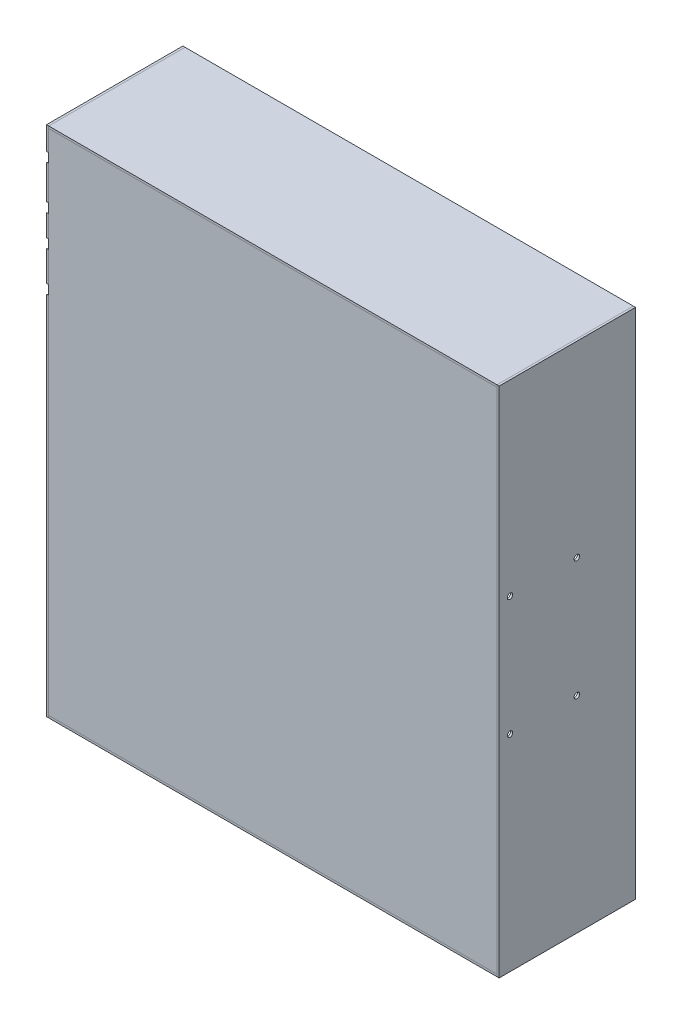
ISO-10303-21;
HEADER;
FILE_DESCRIPTION(('STEP AP214'),'2;1');
FILE_NAME('part.step','',(''),(''),'','','');
FILE_SCHEMA(('AUTOMOTIVE_DESIGN { 1 0 10303 214 1 1 1 1 }'));
ENDSEC;
DATA;
#1=APPLICATION_CONTEXT('core data for automotive mechanical design processes');
#2=APPLICATION_PROTOCOL_DEFINITION('international standard','automotive_design',2000,#1);
#3=PRODUCT_CONTEXT('',#1,'mechanical');
#4=PRODUCT('Part','Part','',(#3));
#5=PRODUCT_RELATED_PRODUCT_CATEGORY('part','',(#4));
#6=PRODUCT_DEFINITION_FORMATION('','',#4);
#7=PRODUCT_DEFINITION_CONTEXT('part definition',#1,'design');
#8=PRODUCT_DEFINITION('design','',#6,#7);
#9=PRODUCT_DEFINITION_SHAPE('','',#8);
#10=(LENGTH_UNIT() NAMED_UNIT(*) SI_UNIT(.MILLI.,.METRE.));
#11=(NAMED_UNIT(*) PLANE_ANGLE_UNIT() SI_UNIT($,.RADIAN.));
#12=(NAMED_UNIT(*) SI_UNIT($,.STERADIAN.) SOLID_ANGLE_UNIT());
#13=UNCERTAINTY_MEASURE_WITH_UNIT(LENGTH_MEASURE(1.E-05),#10,'distance_accuracy_value','');
#14=(GEOMETRIC_REPRESENTATION_CONTEXT(3) GLOBAL_UNCERTAINTY_ASSIGNED_CONTEXT((#13)) GLOBAL_UNIT_ASSIGNED_CONTEXT((#10,
#11,#12)) REPRESENTATION_CONTEXT('',''));
#15=CARTESIAN_POINT('',(0.,0.,0.));
#16=DIRECTION('',(0.,0.,1.));
#17=DIRECTION('',(1.,0.,0.));
#18=AXIS2_PLACEMENT_3D('',#15,#16,#17);
#19=CARTESIAN_POINT('',(-256.013393359467,233.,62.5));
#20=DIRECTION('',(0.,1.,0.));
#21=DIRECTION('',(0.,0.,1.));
#22=AXIS2_PLACEMENT_3D('',#19,#20,#21);
#23=PLANE('',#22);
#24=DIRECTION('',(-1.,0.,0.));
#25=VECTOR('',#24,1.);
#26=CARTESIAN_POINT('',(-207.5,233.,-62.5));
#27=LINE('',#26,#25);
#28=CARTESIAN_POINT('',(205.5,233.,-62.5));
#29=VERTEX_POINT('',#28);
#30=CARTESIAN_POINT('',(-205.5,233.,-62.5));
#31=VERTEX_POINT('',#30);
#32=EDGE_CURVE('E101',#29,#31,#27,.T.);
#33=ORIENTED_EDGE('',*,*,#32,.F.);
#34=DIRECTION('',(0.,0.,-1.));
#35=VECTOR('',#34,1.);
#36=CARTESIAN_POINT('',(205.5,233.,0.));
#37=LINE('',#36,#35);
#38=CARTESIAN_POINT('',(205.5,233.,62.5));
#39=VERTEX_POINT('',#38);
#40=EDGE_CURVE('E12',#39,#29,#37,.T.);
#41=ORIENTED_EDGE('',*,*,#40,.F.);
#42=DIRECTION('',(1.,0.,0.));
#43=VECTOR('',#42,1.);
#44=CARTESIAN_POINT('',(-207.5,233.,62.5));
#45=LINE('',#44,#43);
#46=CARTESIAN_POINT('',(-205.5,233.,62.5));
#47=VERTEX_POINT('',#46);
#48=EDGE_CURVE('E104',#47,#39,#45,.T.);
#49=ORIENTED_EDGE('',*,*,#48,.F.);
#50=DIRECTION('',(0.,0.,1.));
#51=VECTOR('',#50,1.);
#52=CARTESIAN_POINT('',(-205.5,233.,0.));
#53=LINE('',#52,#51);
#54=EDGE_CURVE('E60',#31,#47,#53,.T.);
#55=ORIENTED_EDGE('',*,*,#54,.F.);
#56=EDGE_LOOP('',(#33,#41,#49,#55));
#57=FACE_BOUND('',#56,.T.);
#58=ADVANCED_FACE('F51',(#57),#23,.F.);
#59=CARTESIAN_POINT('',(205.5,235.,-133.832293437024));
#60=DIRECTION('',(-1.,0.,0.));
#61=DIRECTION('',(0.,0.,1.));
#62=AXIS2_PLACEMENT_3D('',#59,#60,#61);
#63=PLANE('',#62);
#64=DIRECTION('',(0.,1.,0.));
#65=VECTOR('',#64,1.);
#66=CARTESIAN_POINT('',(205.5,235.,62.5));
#67=LINE('',#66,#65);
#68=CARTESIAN_POINT('',(205.5,235.,62.5));
#69=VERTEX_POINT('',#68);
#70=EDGE_CURVE('E68',#39,#69,#67,.T.);
#71=ORIENTED_EDGE('',*,*,#70,.F.);
#72=ORIENTED_EDGE('',*,*,#40,.T.);
#73=DIRECTION('',(0.,-1.,0.));
#74=VECTOR('',#73,1.);
#75=CARTESIAN_POINT('',(205.5,235.,-62.5));
#76=LINE('',#75,#74);
#77=CARTESIAN_POINT('',(205.5,235.,-62.5));
#78=VERTEX_POINT('',#77);
#79=EDGE_CURVE('E96',#78,#29,#76,.T.);
#80=ORIENTED_EDGE('',*,*,#79,.F.);
#81=DIRECTION('',(0.,0.,-1.));
#82=VECTOR('',#81,1.);
#83=CARTESIAN_POINT('',(205.5,235.,0.));
#84=LINE('',#83,#82);
#85=EDGE_CURVE('E115',#69,#78,#84,.T.);
#86=ORIENTED_EDGE('',*,*,#85,.F.);
#87=EDGE_LOOP('',(#71,#72,#80,#86));
#88=FACE_BOUND('',#87,.T.);
#89=ADVANCED_FACE('F94',(#88),#63,.F.);
#90=CARTESIAN_POINT('',(-205.5,235.,-133.832293437024));
#91=DIRECTION('',(1.,0.,0.));
#92=DIRECTION('',(0.,0.,-1.));
#93=AXIS2_PLACEMENT_3D('',#90,#91,#92);
#94=PLANE('',#93);
#95=DIRECTION('',(0.,1.,0.));
#96=VECTOR('',#95,1.);
#97=CARTESIAN_POINT('',(-205.5,235.,-62.5));
#98=LINE('',#97,#96);
#99=CARTESIAN_POINT('',(-205.5,235.,-62.5));
#100=VERTEX_POINT('',#99);
#101=EDGE_CURVE('E109',#31,#100,#98,.T.);
#102=ORIENTED_EDGE('',*,*,#101,.F.);
#103=ORIENTED_EDGE('',*,*,#54,.T.);
#104=DIRECTION('',(0.,1.,0.));
#105=VECTOR('',#104,1.);
#106=CARTESIAN_POINT('',(-205.5,235.,62.5));
#107=LINE('',#106,#105);
#108=CARTESIAN_POINT('',(-205.5,235.,62.5));
#109=VERTEX_POINT('',#108);
#110=EDGE_CURVE('E55',#47,#109,#107,.T.);
#111=ORIENTED_EDGE('',*,*,#110,.T.);
#112=DIRECTION('',(0.,0.,1.));
#113=VECTOR('',#112,1.);
#114=CARTESIAN_POINT('',(-205.5,235.,0.));
#115=LINE('',#114,#113);
#116=EDGE_CURVE('E112',#100,#109,#115,.T.);
#117=ORIENTED_EDGE('',*,*,#116,.F.);
#118=EDGE_LOOP('',(#102,#103,#111,#117));
#119=FACE_BOUND('',#118,.T.);
#120=ADVANCED_FACE('F132',(#119),#94,.F.);
#121=CARTESIAN_POINT('',(-207.5,235.,-62.5));
#122=DIRECTION('',(0.,0.,1.));
#123=DIRECTION('',(1.,0.,0.));
#124=AXIS2_PLACEMENT_3D('',#121,#122,#123);
#125=PLANE('',#124);
#126=ORIENTED_EDGE('',*,*,#79,.T.);
#127=ORIENTED_EDGE('',*,*,#32,.T.);
#128=ORIENTED_EDGE('',*,*,#101,.T.);
#129=DIRECTION('',(-1.,0.,0.));
#130=VECTOR('',#129,1.);
#131=CARTESIAN_POINT('',(-207.5,235.,-62.5));
#132=LINE('',#131,#130);
#133=EDGE_CURVE('E108',#78,#100,#132,.T.);
#134=ORIENTED_EDGE('',*,*,#133,.F.);
#135=EDGE_LOOP('',(#126,#127,#128,#134));
#136=FACE_BOUND('',#135,.T.);
#137=ADVANCED_FACE('F53',(#136),#125,.F.);
#138=CARTESIAN_POINT('',(-207.5,235.,62.5));
#139=DIRECTION('',(0.,0.,-1.));
#140=DIRECTION('',(-1.,0.,0.));
#141=AXIS2_PLACEMENT_3D('',#138,#139,#140);
#142=PLANE('',#141);
#143=ORIENTED_EDGE('',*,*,#110,.F.);
#144=ORIENTED_EDGE('',*,*,#48,.T.);
#145=ORIENTED_EDGE('',*,*,#70,.T.);
#146=DIRECTION('',(1.,0.,0.));
#147=VECTOR('',#146,1.);
#148=CARTESIAN_POINT('',(-207.5,235.,62.5));
#149=LINE('',#148,#147);
#150=EDGE_CURVE('E120',#109,#69,#149,.T.);
#151=ORIENTED_EDGE('',*,*,#150,.F.);
#152=EDGE_LOOP('',(#143,#144,#145,#151));
#153=FACE_BOUND('',#152,.T.);
#154=ADVANCED_FACE('F124',(#153),#142,.F.);
#155=CARTESIAN_POINT('',(0.,235.,0.));
#156=DIRECTION('',(0.,-1.,0.));
#157=DIRECTION('',(0.,0.,-1.));
#158=AXIS2_PLACEMENT_3D('',#155,#156,#157);
#159=PLANE('',#158);
#160=ORIENTED_EDGE('',*,*,#133,.T.);
#161=ORIENTED_EDGE('',*,*,#116,.T.);
#162=ORIENTED_EDGE('',*,*,#150,.T.);
#163=ORIENTED_EDGE('',*,*,#85,.T.);
#164=EDGE_LOOP('',(#160,#161,#162,#163));
#165=FACE_BOUND('',#164,.T.);
#166=ADVANCED_FACE('F123',(#165),#159,.F.);
#167=CLOSED_SHELL('',(#58,#89,#120,#137,#154,#166));
#168=MANIFOLD_SOLID_BREP('B2',#167);
#169=CARTESIAN_POINT('',(-301.446567486664,-233.,62.5));
#170=DIRECTION('',(0.,-1.,0.));
#171=DIRECTION('',(0.,0.,-1.));
#172=AXIS2_PLACEMENT_3D('',#169,#170,#171);
#173=PLANE('',#172);
#174=DIRECTION('',(-1.,0.,0.));
#175=VECTOR('',#174,1.);
#176=CARTESIAN_POINT('',(-207.5,-233.,62.5));
#177=LINE('',#176,#175);
#178=CARTESIAN_POINT('',(205.5,-233.,62.5));
#179=VERTEX_POINT('',#178);
#180=CARTESIAN_POINT('',(-205.5,-233.,62.5));
#181=VERTEX_POINT('',#180);
#182=EDGE_CURVE('E261',#179,#181,#177,.T.);
#183=ORIENTED_EDGE('',*,*,#182,.F.);
#184=DIRECTION('',(0.,0.,-1.));
#185=VECTOR('',#184,1.);
#186=CARTESIAN_POINT('',(205.5,-233.,0.));
#187=LINE('',#186,#185);
#188=CARTESIAN_POINT('',(205.5,-233.,-62.5));
#189=VERTEX_POINT('',#188);
#190=EDGE_CURVE('E257',#179,#189,#187,.T.);
#191=ORIENTED_EDGE('',*,*,#190,.T.);
#192=DIRECTION('',(1.,0.,0.));
#193=VECTOR('',#192,1.);
#194=CARTESIAN_POINT('',(-207.5,-233.,-62.5));
#195=LINE('',#194,#193);
#196=CARTESIAN_POINT('',(-205.5,-233.,-62.5));
#197=VERTEX_POINT('',#196);
#198=EDGE_CURVE('E259',#197,#189,#195,.T.);
#199=ORIENTED_EDGE('',*,*,#198,.F.);
#200=DIRECTION('',(0.,0.,1.));
#201=VECTOR('',#200,1.);
#202=CARTESIAN_POINT('',(-205.5,-233.,0.));
#203=LINE('',#202,#201);
#204=EDGE_CURVE('E265',#197,#181,#203,.T.);
#205=ORIENTED_EDGE('',*,*,#204,.T.);
#206=EDGE_LOOP('',(#183,#191,#199,#205));
#207=FACE_BOUND('',#206,.T.);
#208=ADVANCED_FACE('F211',(#207),#173,.F.);
#209=CARTESIAN_POINT('',(0.,-235.,0.));
#210=DIRECTION('',(0.,-1.,0.));
#211=DIRECTION('',(0.,0.,-1.));
#212=AXIS2_PLACEMENT_3D('',#209,#210,#211);
#213=PLANE('',#212);
#214=DIRECTION('',(0.,0.,1.));
#215=VECTOR('',#214,1.);
#216=CARTESIAN_POINT('',(-205.5,-235.,0.));
#217=LINE('',#216,#215);
#218=CARTESIAN_POINT('',(-205.5,-235.,-62.5));
#219=VERTEX_POINT('',#218);
#220=CARTESIAN_POINT('',(-205.5,-235.,62.5));
#221=VERTEX_POINT('',#220);
#222=EDGE_CURVE('E221',#219,#221,#217,.T.);
#223=ORIENTED_EDGE('',*,*,#222,.F.);
#224=DIRECTION('',(-1.,0.,0.));
#225=VECTOR('',#224,1.);
#226=CARTESIAN_POINT('',(-207.5,-235.,-62.5));
#227=LINE('',#226,#225);
#228=CARTESIAN_POINT('',(205.5,-235.,-62.5));
#229=VERTEX_POINT('',#228);
#230=EDGE_CURVE('E279',#229,#219,#227,.T.);
#231=ORIENTED_EDGE('',*,*,#230,.F.);
#232=DIRECTION('',(0.,0.,-1.));
#233=VECTOR('',#232,1.);
#234=CARTESIAN_POINT('',(205.5,-235.,0.));
#235=LINE('',#234,#233);
#236=CARTESIAN_POINT('',(205.5,-235.,62.5));
#237=VERTEX_POINT('',#236);
#238=EDGE_CURVE('E49',#237,#229,#235,.T.);
#239=ORIENTED_EDGE('',*,*,#238,.F.);
#240=DIRECTION('',(1.,0.,0.));
#241=VECTOR('',#240,1.);
#242=CARTESIAN_POINT('',(-207.5,-235.,62.5));
#243=LINE('',#242,#241);
#244=EDGE_CURVE('E275',#221,#237,#243,.T.);
#245=ORIENTED_EDGE('',*,*,#244,.F.);
#246=EDGE_LOOP('',(#223,#231,#239,#245));
#247=FACE_BOUND('',#246,.T.);
#248=ADVANCED_FACE('F285',(#247),#213,.T.);
#249=CARTESIAN_POINT('',(-207.5,235.,-62.5));
#250=DIRECTION('',(0.,0.,1.));
#251=DIRECTION('',(1.,0.,0.));
#252=AXIS2_PLACEMENT_3D('',#249,#250,#251);
#253=PLANE('',#252);
#254=DIRECTION('',(0.,1.,0.));
#255=VECTOR('',#254,1.);
#256=CARTESIAN_POINT('',(-205.5,235.,-62.5));
#257=LINE('',#256,#255);
#258=EDGE_CURVE('E270',#219,#197,#257,.T.);
#259=ORIENTED_EDGE('',*,*,#258,.T.);
#260=ORIENTED_EDGE('',*,*,#198,.T.);
#261=DIRECTION('',(0.,-1.,0.));
#262=VECTOR('',#261,1.);
#263=CARTESIAN_POINT('',(205.5,235.,-62.5));
#264=LINE('',#263,#262);
#265=EDGE_CURVE('E215',#189,#229,#264,.T.);
#266=ORIENTED_EDGE('',*,*,#265,.T.);
#267=ORIENTED_EDGE('',*,*,#230,.T.);
#268=EDGE_LOOP('',(#259,#260,#266,#267));
#269=FACE_BOUND('',#268,.T.);
#270=ADVANCED_FACE('F268',(#269),#253,.F.);
#271=CARTESIAN_POINT('',(-207.5,235.,62.5));
#272=DIRECTION('',(0.,0.,-1.));
#273=DIRECTION('',(-1.,0.,0.));
#274=AXIS2_PLACEMENT_3D('',#271,#272,#273);
#275=PLANE('',#274);
#276=DIRECTION('',(0.,1.,0.));
#277=VECTOR('',#276,1.);
#278=CARTESIAN_POINT('',(205.5,235.,62.5));
#279=LINE('',#278,#277);
#280=EDGE_CURVE('E273',#237,#179,#279,.T.);
#281=ORIENTED_EDGE('',*,*,#280,.T.);
#282=ORIENTED_EDGE('',*,*,#182,.T.);
#283=DIRECTION('',(0.,1.,0.));
#284=VECTOR('',#283,1.);
#285=CARTESIAN_POINT('',(-205.5,235.,62.5));
#286=LINE('',#285,#284);
#287=EDGE_CURVE('E229',#221,#181,#286,.T.);
#288=ORIENTED_EDGE('',*,*,#287,.F.);
#289=ORIENTED_EDGE('',*,*,#244,.T.);
#290=EDGE_LOOP('',(#281,#282,#288,#289));
#291=FACE_BOUND('',#290,.T.);
#292=ADVANCED_FACE('F213',(#291),#275,.F.);
#293=CARTESIAN_POINT('',(-205.5,235.,-133.832293437024));
#294=DIRECTION('',(1.,0.,0.));
#295=DIRECTION('',(0.,0.,-1.));
#296=AXIS2_PLACEMENT_3D('',#293,#294,#295);
#297=PLANE('',#296);
#298=ORIENTED_EDGE('',*,*,#287,.T.);
#299=ORIENTED_EDGE('',*,*,#204,.F.);
#300=ORIENTED_EDGE('',*,*,#258,.F.);
#301=ORIENTED_EDGE('',*,*,#222,.T.);
#302=EDGE_LOOP('',(#298,#299,#300,#301));
#303=FACE_BOUND('',#302,.T.);
#304=ADVANCED_FACE('F287',(#303),#297,.F.);
#305=CARTESIAN_POINT('',(205.5,235.,-133.832293437024));
#306=DIRECTION('',(-1.,0.,0.));
#307=DIRECTION('',(0.,0.,1.));
#308=AXIS2_PLACEMENT_3D('',#305,#306,#307);
#309=PLANE('',#308);
#310=ORIENTED_EDGE('',*,*,#265,.F.);
#311=ORIENTED_EDGE('',*,*,#190,.F.);
#312=ORIENTED_EDGE('',*,*,#280,.F.);
#313=ORIENTED_EDGE('',*,*,#238,.T.);
#314=EDGE_LOOP('',(#310,#311,#312,#313));
#315=FACE_BOUND('',#314,.T.);
#316=ADVANCED_FACE('F272',(#315),#309,.F.);
#317=CLOSED_SHELL('',(#208,#248,#270,#292,#304,#316));
#318=MANIFOLD_SOLID_BREP('B6',#317);
#319=CARTESIAN_POINT('',(-256.013393359467,233.,62.5));
#320=DIRECTION('',(0.,1.,0.));
#321=DIRECTION('',(0.,0.,1.));
#322=AXIS2_PLACEMENT_3D('',#319,#320,#321);
#323=PLANE('',#322);
#324=DIRECTION('',(1.,0.,0.));
#325=VECTOR('',#324,1.);
#326=CARTESIAN_POINT('',(-207.5,233.,62.5));
#327=LINE('',#326,#325);
#328=CARTESIAN_POINT('',(-205.5,233.,62.5));
#329=VERTEX_POINT('',#328);
#330=CARTESIAN_POINT('',(205.5,233.,62.5));
#331=VERTEX_POINT('',#330);
#332=EDGE_CURVE('E380',#329,#331,#327,.T.);
#333=ORIENTED_EDGE('',*,*,#332,.T.);
#334=DIRECTION('',(0.,0.,-1.));
#335=VECTOR('',#334,1.);
#336=CARTESIAN_POINT('',(205.5,233.,-133.832293437024));
#337=LINE('',#336,#335);
#338=CARTESIAN_POINT('',(205.5,233.,60.5));
#339=VERTEX_POINT('',#338);
#340=EDGE_CURVE('E427',#331,#339,#337,.T.);
#341=ORIENTED_EDGE('',*,*,#340,.T.);
#342=DIRECTION('',(1.,0.,0.));
#343=VECTOR('',#342,1.);
#344=CARTESIAN_POINT('',(0.,233.,60.5));
#345=LINE('',#344,#343);
#346=CARTESIAN_POINT('',(-205.5,233.,60.5));
#347=VERTEX_POINT('',#346);
#348=EDGE_CURVE('E422',#347,#339,#345,.T.);
#349=ORIENTED_EDGE('',*,*,#348,.F.);
#350=DIRECTION('',(0.,0.,1.));
#351=VECTOR('',#350,1.);
#352=CARTESIAN_POINT('',(-205.5,233.,-133.832293437024));
#353=LINE('',#352,#351);
#354=EDGE_CURVE('E424',#347,#329,#353,.T.);
#355=ORIENTED_EDGE('',*,*,#354,.T.);
#356=EDGE_LOOP('',(#333,#341,#349,#355));
#357=FACE_BOUND('',#356,.T.);
#358=ADVANCED_FACE('F377',(#357),#323,.T.);
#359=CARTESIAN_POINT('',(-301.446567486664,-233.,62.5));
#360=DIRECTION('',(0.,-1.,0.));
#361=DIRECTION('',(0.,0.,-1.));
#362=AXIS2_PLACEMENT_3D('',#359,#360,#361);
#363=PLANE('',#362);
#364=DIRECTION('',(-1.,0.,0.));
#365=VECTOR('',#364,1.);
#366=CARTESIAN_POINT('',(-207.5,-233.,62.5));
#367=LINE('',#366,#365);
#368=CARTESIAN_POINT('',(205.5,-233.,62.5));
#369=VERTEX_POINT('',#368);
#370=CARTESIAN_POINT('',(-205.5,-233.,62.5));
#371=VERTEX_POINT('',#370);
#372=EDGE_CURVE('E385',#369,#371,#367,.T.);
#373=ORIENTED_EDGE('',*,*,#372,.T.);
#374=DIRECTION('',(0.,0.,-1.));
#375=VECTOR('',#374,1.);
#376=CARTESIAN_POINT('',(-205.5,-233.,-133.832293437024));
#377=LINE('',#376,#375);
#378=CARTESIAN_POINT('',(-205.5,-233.,60.5));
#379=VERTEX_POINT('',#378);
#380=EDGE_CURVE('E431',#371,#379,#377,.T.);
#381=ORIENTED_EDGE('',*,*,#380,.T.);
#382=DIRECTION('',(1.,0.,0.));
#383=VECTOR('',#382,1.);
#384=CARTESIAN_POINT('',(0.,-233.,60.5));
#385=LINE('',#384,#383);
#386=CARTESIAN_POINT('',(205.5,-233.,60.5));
#387=VERTEX_POINT('',#386);
#388=EDGE_CURVE('E209',#379,#387,#385,.T.);
#389=ORIENTED_EDGE('',*,*,#388,.T.);
#390=DIRECTION('',(0.,0.,1.));
#391=VECTOR('',#390,1.);
#392=CARTESIAN_POINT('',(205.5,-233.,-133.832293437024));
#393=LINE('',#392,#391);
#394=EDGE_CURVE('E432',#387,#369,#393,.T.);
#395=ORIENTED_EDGE('',*,*,#394,.T.);
#396=EDGE_LOOP('',(#373,#381,#389,#395));
#397=FACE_BOUND('',#396,.T.);
#398=ADVANCED_FACE('F451',(#397),#363,.T.);
#399=CARTESIAN_POINT('',(205.5,235.,-133.832293437024));
#400=DIRECTION('',(-1.,0.,0.));
#401=DIRECTION('',(0.,0.,1.));
#402=AXIS2_PLACEMENT_3D('',#399,#400,#401);
#403=PLANE('',#402);
#404=ORIENTED_EDGE('',*,*,#340,.F.);
#405=DIRECTION('',(0.,1.,0.));
#406=VECTOR('',#405,1.);
#407=CARTESIAN_POINT('',(205.5,235.,62.5));
#408=LINE('',#407,#406);
#409=EDGE_CURVE('E437',#369,#331,#408,.T.);
#410=ORIENTED_EDGE('',*,*,#409,.F.);
#411=ORIENTED_EDGE('',*,*,#394,.F.);
#412=DIRECTION('',(0.,-1.,0.));
#413=VECTOR('',#412,1.);
#414=CARTESIAN_POINT('',(205.5,235.,60.5));
#415=LINE('',#414,#413);
#416=EDGE_CURVE('E393',#339,#387,#415,.T.);
#417=ORIENTED_EDGE('',*,*,#416,.F.);
#418=EDGE_LOOP('',(#404,#410,#411,#417));
#419=FACE_BOUND('',#418,.T.);
#420=ADVANCED_FACE('F450',(#419),#403,.F.);
#421=CARTESIAN_POINT('',(-205.5,235.,-133.832293437024));
#422=DIRECTION('',(1.,0.,0.));
#423=DIRECTION('',(0.,0.,-1.));
#424=AXIS2_PLACEMENT_3D('',#421,#422,#423);
#425=PLANE('',#424);
#426=ORIENTED_EDGE('',*,*,#354,.F.);
#427=DIRECTION('',(0.,-1.,0.));
#428=VECTOR('',#427,1.);
#429=CARTESIAN_POINT('',(-205.5,235.,60.5));
#430=LINE('',#429,#428);
#431=EDGE_CURVE('E401',#347,#379,#430,.T.);
#432=ORIENTED_EDGE('',*,*,#431,.T.);
#433=ORIENTED_EDGE('',*,*,#380,.F.);
#434=DIRECTION('',(0.,1.,0.));
#435=VECTOR('',#434,1.);
#436=CARTESIAN_POINT('',(-205.5,235.,62.5));
#437=LINE('',#436,#435);
#438=EDGE_CURVE('E430',#371,#329,#437,.T.);
#439=ORIENTED_EDGE('',*,*,#438,.T.);
#440=EDGE_LOOP('',(#426,#432,#433,#439));
#441=FACE_BOUND('',#440,.T.);
#442=ADVANCED_FACE('F429',(#441),#425,.F.);
#443=CARTESIAN_POINT('',(-207.5,235.,60.5));
#444=DIRECTION('',(0.,0.,-1.));
#445=DIRECTION('',(-1.,0.,0.));
#446=AXIS2_PLACEMENT_3D('',#443,#444,#445);
#447=PLANE('',#446);
#448=ORIENTED_EDGE('',*,*,#388,.F.);
#449=ORIENTED_EDGE('',*,*,#431,.F.);
#450=ORIENTED_EDGE('',*,*,#348,.T.);
#451=ORIENTED_EDGE('',*,*,#416,.T.);
#452=EDGE_LOOP('',(#448,#449,#450,#451));
#453=FACE_BOUND('',#452,.T.);
#454=ADVANCED_FACE('F434',(#453),#447,.T.);
#455=CARTESIAN_POINT('',(-207.5,235.,62.5));
#456=DIRECTION('',(0.,0.,-1.));
#457=DIRECTION('',(-1.,0.,0.));
#458=AXIS2_PLACEMENT_3D('',#455,#456,#457);
#459=PLANE('',#458);
#460=ORIENTED_EDGE('',*,*,#332,.F.);
#461=ORIENTED_EDGE('',*,*,#438,.F.);
#462=ORIENTED_EDGE('',*,*,#372,.F.);
#463=ORIENTED_EDGE('',*,*,#409,.T.);
#464=EDGE_LOOP('',(#460,#461,#462,#463));
#465=FACE_BOUND('',#464,.T.);
#466=ADVANCED_FACE('F447',(#465),#459,.F.);
#467=CLOSED_SHELL('',(#358,#398,#420,#442,#454,#466));
#468=MANIFOLD_SOLID_BREP('B43',#467);
#469=CARTESIAN_POINT('',(205.5,235.,-133.832293437024));
#470=DIRECTION('',(-1.,0.,0.));
#471=DIRECTION('',(0.,0.,1.));
#472=AXIS2_PLACEMENT_3D('',#469,#470,#471);
#473=PLANE('',#472);
#474=DIRECTION('',(0.,0.,-1.));
#475=VECTOR('',#474,1.);
#476=CARTESIAN_POINT('',(205.5,235.,0.));
#477=LINE('',#476,#475);
#478=CARTESIAN_POINT('',(205.5,235.,62.5));
#479=VERTEX_POINT('',#478);
#480=CARTESIAN_POINT('',(205.5,235.,-62.5));
#481=VERTEX_POINT('',#480);
#482=EDGE_CURVE('E698',#479,#481,#477,.T.);
#483=ORIENTED_EDGE('',*,*,#482,.T.);
#484=DIRECTION('',(0.,-1.,0.));
#485=VECTOR('',#484,1.);
#486=CARTESIAN_POINT('',(205.5,235.,-62.5));
#487=LINE('',#486,#485);
#488=CARTESIAN_POINT('',(205.5,-235.,-62.5));
#489=VERTEX_POINT('',#488);
#490=EDGE_CURVE('E704',#481,#489,#487,.T.);
#491=ORIENTED_EDGE('',*,*,#490,.T.);
#492=DIRECTION('',(0.,0.,-1.));
#493=VECTOR('',#492,1.);
#494=CARTESIAN_POINT('',(205.5,-235.,0.));
#495=LINE('',#494,#493);
#496=CARTESIAN_POINT('',(205.5,-235.,62.5));
#497=VERTEX_POINT('',#496);
#498=EDGE_CURVE('E652',#497,#489,#495,.T.);
#499=ORIENTED_EDGE('',*,*,#498,.F.);
#500=DIRECTION('',(0.,1.,0.));
#501=VECTOR('',#500,1.);
#502=CARTESIAN_POINT('',(205.5,235.,62.5));
#503=LINE('',#502,#501);
#504=EDGE_CURVE('E706',#497,#479,#503,.T.);
#505=ORIENTED_EDGE('',*,*,#504,.T.);
#506=EDGE_LOOP('',(#483,#491,#499,#505));
#507=FACE_BOUND('',#506,.T.);
#508=CARTESIAN_POINT('',(205.5,63.1555000474577,-8.73707610281826));
#509=DIRECTION('',(-1.,0.,0.));
#510=DIRECTION('',(0.,0.,1.));
#511=AXIS2_PLACEMENT_3D('',#508,#509,#510);
#512=CIRCLE('',#511,2.49999999999998);
#513=CARTESIAN_POINT('',(205.5,63.1555000474577,-6.23707610281828));
#514=VERTEX_POINT('',#513);
#515=EDGE_CURVE('E529',#514,#514,#512,.F.);
#516=ORIENTED_EDGE('',*,*,#515,.T.);
#517=EDGE_LOOP('',(#516));
#518=FACE_BOUND('',#517,.T.);
#519=CARTESIAN_POINT('',(205.5,-46.3891802152148,-8.73707610281826));
#520=DIRECTION('',(-1.,0.,0.));
#521=DIRECTION('',(0.,0.,1.));
#522=AXIS2_PLACEMENT_3D('',#519,#520,#521);
#523=CIRCLE('',#522,2.5);
#524=CARTESIAN_POINT('',(205.5,-46.3891802152148,-6.23707610281827));
#525=VERTEX_POINT('',#524);
#526=EDGE_CURVE('E658',#525,#525,#523,.F.);
#527=ORIENTED_EDGE('',*,*,#526,.T.);
#528=EDGE_LOOP('',(#527));
#529=FACE_BOUND('',#528,.T.);
#530=CARTESIAN_POINT('',(205.5,-46.3891802152148,52.5373382608336));
#531=DIRECTION('',(-1.,0.,0.));
#532=DIRECTION('',(0.,0.,1.));
#533=AXIS2_PLACEMENT_3D('',#530,#531,#532);
#534=CIRCLE('',#533,2.5);
#535=CARTESIAN_POINT('',(205.5,-46.3891802152148,55.0373382608336));
#536=VERTEX_POINT('',#535);
#537=EDGE_CURVE('E719',#536,#536,#534,.F.);
#538=ORIENTED_EDGE('',*,*,#537,.T.);
#539=EDGE_LOOP('',(#538));
#540=FACE_BOUND('',#539,.T.);
#541=CARTESIAN_POINT('',(205.5,63.1555000474577,52.5373382608336));
#542=DIRECTION('',(-1.,0.,0.));
#543=DIRECTION('',(0.,0.,1.));
#544=AXIS2_PLACEMENT_3D('',#541,#542,#543);
#545=CIRCLE('',#544,2.49999999999999);
#546=CARTESIAN_POINT('',(205.5,63.1555000474577,55.0373382608336));
#547=VERTEX_POINT('',#546);
#548=EDGE_CURVE('E722',#547,#547,#545,.F.);
#549=ORIENTED_EDGE('',*,*,#548,.T.);
#550=EDGE_LOOP('',(#549));
#551=FACE_BOUND('',#550,.T.);
#552=ADVANCED_FACE('F648',(#507,#518,#529,#540,#551),#473,.T.);
#553=CARTESIAN_POINT('',(-207.5,235.,-62.5));
#554=DIRECTION('',(0.,0.,1.));
#555=DIRECTION('',(1.,0.,0.));
#556=AXIS2_PLACEMENT_3D('',#553,#554,#555);
#557=PLANE('',#556);
#558=ORIENTED_EDGE('',*,*,#490,.F.);
#559=DIRECTION('',(-1.,0.,0.));
#560=VECTOR('',#559,1.);
#561=CARTESIAN_POINT('',(-207.5,235.,-62.5));
#562=LINE('',#561,#560);
#563=CARTESIAN_POINT('',(207.5,235.,-62.5));
#564=VERTEX_POINT('',#563);
#565=EDGE_CURVE('E694',#564,#481,#562,.T.);
#566=ORIENTED_EDGE('',*,*,#565,.F.);
#567=DIRECTION('',(0.,-1.,0.));
#568=VECTOR('',#567,1.);
#569=CARTESIAN_POINT('',(207.5,235.,-62.5));
#570=LINE('',#569,#568);
#571=CARTESIAN_POINT('',(207.5,-235.,-62.5));
#572=VERTEX_POINT('',#571);
#573=EDGE_CURVE('E742',#564,#572,#570,.T.);
#574=ORIENTED_EDGE('',*,*,#573,.T.);
#575=DIRECTION('',(-1.,0.,0.));
#576=VECTOR('',#575,1.);
#577=CARTESIAN_POINT('',(-207.5,-235.,-62.5));
#578=LINE('',#577,#576);
#579=EDGE_CURVE('E667',#572,#489,#578,.T.);
#580=ORIENTED_EDGE('',*,*,#579,.T.);
#581=EDGE_LOOP('',(#558,#566,#574,#580));
#582=FACE_BOUND('',#581,.T.);
#583=ADVANCED_FACE('F705',(#582),#557,.F.);
#584=CARTESIAN_POINT('',(-207.5,235.,62.5));
#585=DIRECTION('',(0.,0.,-1.));
#586=DIRECTION('',(-1.,0.,0.));
#587=AXIS2_PLACEMENT_3D('',#584,#585,#586);
#588=PLANE('',#587);
#589=ORIENTED_EDGE('',*,*,#504,.F.);
#590=DIRECTION('',(1.,0.,0.));
#591=VECTOR('',#590,1.);
#592=CARTESIAN_POINT('',(-207.5,-235.,62.5));
#593=LINE('',#592,#591);
#594=CARTESIAN_POINT('',(207.5,-235.,62.5));
#595=VERTEX_POINT('',#594);
#596=EDGE_CURVE('E713',#497,#595,#593,.T.);
#597=ORIENTED_EDGE('',*,*,#596,.T.);
#598=DIRECTION('',(0.,-1.,0.));
#599=VECTOR('',#598,1.);
#600=CARTESIAN_POINT('',(207.5,235.,62.5));
#601=LINE('',#600,#599);
#602=CARTESIAN_POINT('',(207.5,235.,62.5));
#603=VERTEX_POINT('',#602);
#604=EDGE_CURVE('E711',#603,#595,#601,.T.);
#605=ORIENTED_EDGE('',*,*,#604,.F.);
#606=DIRECTION('',(1.,0.,0.));
#607=VECTOR('',#606,1.);
#608=CARTESIAN_POINT('',(-207.5,235.,62.5));
#609=LINE('',#608,#607);
#610=EDGE_CURVE('E679',#479,#603,#609,.T.);
#611=ORIENTED_EDGE('',*,*,#610,.F.);
#612=EDGE_LOOP('',(#589,#597,#605,#611));
#613=FACE_BOUND('',#612,.T.);
#614=ADVANCED_FACE('F650',(#613),#588,.F.);
#615=CARTESIAN_POINT('',(0.,235.,0.));
#616=DIRECTION('',(0.,-1.,0.));
#617=DIRECTION('',(0.,0.,-1.));
#618=AXIS2_PLACEMENT_3D('',#615,#616,#617);
#619=PLANE('',#618);
#620=ORIENTED_EDGE('',*,*,#482,.F.);
#621=ORIENTED_EDGE('',*,*,#610,.T.);
#622=DIRECTION('',(0.,0.,-1.));
#623=VECTOR('',#622,1.);
#624=CARTESIAN_POINT('',(207.5,235.,62.5));
#625=LINE('',#624,#623);
#626=EDGE_CURVE('E700',#603,#564,#625,.T.);
#627=ORIENTED_EDGE('',*,*,#626,.T.);
#628=ORIENTED_EDGE('',*,*,#565,.T.);
#629=EDGE_LOOP('',(#620,#621,#627,#628));
#630=FACE_BOUND('',#629,.T.);
#631=ADVANCED_FACE('F696',(#630),#619,.F.);
#632=CARTESIAN_POINT('',(0.,-235.,0.));
#633=DIRECTION('',(0.,-1.,0.));
#634=DIRECTION('',(0.,0.,-1.));
#635=AXIS2_PLACEMENT_3D('',#632,#633,#634);
#636=PLANE('',#635);
#637=ORIENTED_EDGE('',*,*,#596,.F.);
#638=ORIENTED_EDGE('',*,*,#498,.T.);
#639=ORIENTED_EDGE('',*,*,#579,.F.);
#640=DIRECTION('',(0.,0.,-1.));
#641=VECTOR('',#640,1.);
#642=CARTESIAN_POINT('',(207.5,-235.,62.5));
#643=LINE('',#642,#641);
#644=EDGE_CURVE('E715',#595,#572,#643,.T.);
#645=ORIENTED_EDGE('',*,*,#644,.F.);
#646=EDGE_LOOP('',(#637,#638,#639,#645));
#647=FACE_BOUND('',#646,.T.);
#648=ADVANCED_FACE('F747',(#647),#636,.T.);
#649=CARTESIAN_POINT('',(207.5,235.,62.5));
#650=DIRECTION('',(-1.,0.,0.));
#651=DIRECTION('',(0.,0.,1.));
#652=AXIS2_PLACEMENT_3D('',#649,#650,#651);
#653=PLANE('',#652);
#654=CARTESIAN_POINT('',(207.5,63.1555000474577,-8.73707610281826));
#655=DIRECTION('',(1.,0.,0.));
#656=DIRECTION('',(0.,0.,1.));
#657=AXIS2_PLACEMENT_3D('',#654,#655,#656);
#658=CIRCLE('',#657,2.49999999999998);
#659=CARTESIAN_POINT('',(207.5,63.1555000474577,-6.23707610281828));
#660=VERTEX_POINT('',#659);
#661=EDGE_CURVE('E725',#660,#660,#658,.T.);
#662=ORIENTED_EDGE('',*,*,#661,.F.);
#663=EDGE_LOOP('',(#662));
#664=FACE_BOUND('',#663,.T.);
#665=CARTESIAN_POINT('',(207.5,-46.3891802152148,-8.73707610281826));
#666=DIRECTION('',(1.,0.,0.));
#667=DIRECTION('',(0.,0.,-1.));
#668=AXIS2_PLACEMENT_3D('',#665,#666,#667);
#669=CIRCLE('',#668,2.5);
#670=CARTESIAN_POINT('',(207.5,-46.3891802152148,-11.2370761028183));
#671=VERTEX_POINT('',#670);
#672=EDGE_CURVE('E729',#671,#671,#669,.T.);
#673=ORIENTED_EDGE('',*,*,#672,.F.);
#674=EDGE_LOOP('',(#673));
#675=FACE_BOUND('',#674,.T.);
#676=CARTESIAN_POINT('',(207.5,-46.3891802152148,52.5373382608336));
#677=DIRECTION('',(1.,0.,0.));
#678=DIRECTION('',(0.,0.,1.));
#679=AXIS2_PLACEMENT_3D('',#676,#677,#678);
#680=CIRCLE('',#679,2.5);
#681=CARTESIAN_POINT('',(207.5,-46.3891802152148,55.0373382608336));
#682=VERTEX_POINT('',#681);
#683=EDGE_CURVE('E726',#682,#682,#680,.T.);
#684=ORIENTED_EDGE('',*,*,#683,.F.);
#685=EDGE_LOOP('',(#684));
#686=FACE_BOUND('',#685,.T.);
#687=CARTESIAN_POINT('',(207.5,63.1555000474577,52.5373382608336));
#688=DIRECTION('',(1.,0.,0.));
#689=DIRECTION('',(0.,0.,-1.));
#690=AXIS2_PLACEMENT_3D('',#687,#688,#689);
#691=CIRCLE('',#690,2.49999999999999);
#692=CARTESIAN_POINT('',(207.5,63.1555000474577,50.0373382608336));
#693=VERTEX_POINT('',#692);
#694=EDGE_CURVE('E730',#693,#693,#691,.T.);
#695=ORIENTED_EDGE('',*,*,#694,.F.);
#696=EDGE_LOOP('',(#695));
#697=FACE_BOUND('',#696,.T.);
#698=ORIENTED_EDGE('',*,*,#644,.T.);
#699=ORIENTED_EDGE('',*,*,#573,.F.);
#700=ORIENTED_EDGE('',*,*,#626,.F.);
#701=ORIENTED_EDGE('',*,*,#604,.T.);
#702=EDGE_LOOP('',(#698,#699,#700,#701));
#703=FACE_BOUND('',#702,.T.);
#704=ADVANCED_FACE('F750',(#664,#675,#686,#697,#703),#653,.F.);
#705=CARTESIAN_POINT('',(205.5,63.1555000474577,52.5373382608336));
#706=DIRECTION('',(1.,0.,0.));
#707=DIRECTION('',(0.,0.,-1.));
#708=AXIS2_PLACEMENT_3D('',#705,#706,#707);
#709=CYLINDRICAL_SURFACE('',#708,2.49999999999999);
#710=ORIENTED_EDGE('',*,*,#548,.F.);
#711=EDGE_LOOP('',(#710));
#712=FACE_BOUND('',#711,.T.);
#713=ORIENTED_EDGE('',*,*,#694,.T.);
#714=EDGE_LOOP('',(#713));
#715=FACE_BOUND('',#714,.T.);
#716=ADVANCED_FACE('F752',(#712,#715),#709,.F.);
#717=CARTESIAN_POINT('',(205.5,-46.3891802152148,52.5373382608336));
#718=DIRECTION('',(1.,0.,0.));
#719=DIRECTION('',(0.,0.,-1.));
#720=AXIS2_PLACEMENT_3D('',#717,#718,#719);
#721=CYLINDRICAL_SURFACE('',#720,2.5);
#722=ORIENTED_EDGE('',*,*,#537,.F.);
#723=EDGE_LOOP('',(#722));
#724=FACE_BOUND('',#723,.T.);
#725=ORIENTED_EDGE('',*,*,#683,.T.);
#726=EDGE_LOOP('',(#725));
#727=FACE_BOUND('',#726,.T.);
#728=ADVANCED_FACE('F759',(#724,#727),#721,.F.);
#729=CARTESIAN_POINT('',(205.5,-46.3891802152148,-8.73707610281826));
#730=DIRECTION('',(1.,0.,0.));
#731=DIRECTION('',(0.,0.,-1.));
#732=AXIS2_PLACEMENT_3D('',#729,#730,#731);
#733=CYLINDRICAL_SURFACE('',#732,2.5);
#734=ORIENTED_EDGE('',*,*,#526,.F.);
#735=EDGE_LOOP('',(#734));
#736=FACE_BOUND('',#735,.T.);
#737=ORIENTED_EDGE('',*,*,#672,.T.);
#738=EDGE_LOOP('',(#737));
#739=FACE_BOUND('',#738,.T.);
#740=ADVANCED_FACE('F802',(#736,#739),#733,.F.);
#741=CARTESIAN_POINT('',(205.5,63.1555000474577,-8.73707610281826));
#742=DIRECTION('',(1.,0.,0.));
#743=DIRECTION('',(0.,0.,-1.));
#744=AXIS2_PLACEMENT_3D('',#741,#742,#743);
#745=CYLINDRICAL_SURFACE('',#744,2.49999999999998);
#746=ORIENTED_EDGE('',*,*,#515,.F.);
#747=EDGE_LOOP('',(#746));
#748=FACE_BOUND('',#747,.T.);
#749=ORIENTED_EDGE('',*,*,#661,.T.);
#750=EDGE_LOOP('',(#749));
#751=FACE_BOUND('',#750,.T.);
#752=ADVANCED_FACE('F772',(#748,#751),#745,.F.);
#753=CLOSED_SHELL('',(#552,#583,#614,#631,#648,#704,#716,#728,#740,#752));
#754=MANIFOLD_SOLID_BREP('B369',#753);
#755=CARTESIAN_POINT('',(-207.5,235.,62.5));
#756=DIRECTION('',(0.,0.,-1.));
#757=DIRECTION('',(-1.,0.,0.));
#758=AXIS2_PLACEMENT_3D('',#755,#756,#757);
#759=PLANE('',#758);
#760=DIRECTION('',(0.,-1.,0.));
#761=VECTOR('',#760,1.);
#762=CARTESIAN_POINT('',(-205.5,235.,62.5));
#763=LINE('',#762,#761);
#764=CARTESIAN_POINT('',(-205.5,100.448420077394,62.5));
#765=VERTEX_POINT('',#764);
#766=CARTESIAN_POINT('',(-205.5,-235.,62.5));
#767=VERTEX_POINT('',#766);
#768=EDGE_CURVE('E891',#765,#767,#763,.T.);
#769=ORIENTED_EDGE('',*,*,#768,.F.);
#770=DIRECTION('',(-1.,0.,0.));
#771=VECTOR('',#770,1.);
#772=CARTESIAN_POINT('',(-205.5,100.448420077394,62.5));
#773=LINE('',#772,#771);
#774=CARTESIAN_POINT('',(-207.5,100.448420077394,62.5));
#775=VERTEX_POINT('',#774);
#776=EDGE_CURVE('E1136',#765,#775,#773,.T.);
#777=ORIENTED_EDGE('',*,*,#776,.T.);
#778=DIRECTION('',(0.,-1.,0.));
#779=VECTOR('',#778,1.);
#780=CARTESIAN_POINT('',(-207.5,235.,62.5));
#781=LINE('',#780,#779);
#782=CARTESIAN_POINT('',(-207.5,-235.,62.5));
#783=VERTEX_POINT('',#782);
#784=EDGE_CURVE('E999',#775,#783,#781,.T.);
#785=ORIENTED_EDGE('',*,*,#784,.T.);
#786=DIRECTION('',(1.,0.,0.));
#787=VECTOR('',#786,1.);
#788=CARTESIAN_POINT('',(-207.5,-235.,62.5));
#789=LINE('',#788,#787);
#790=EDGE_CURVE('E1022',#783,#767,#789,.T.);
#791=ORIENTED_EDGE('',*,*,#790,.T.);
#792=EDGE_LOOP('',(#769,#777,#785,#791));
#793=FACE_BOUND('',#792,.T.);
#794=ADVANCED_FACE('F882',(#793),#759,.F.);
#795=CARTESIAN_POINT('',(-207.5,235.,62.5));
#796=DIRECTION('',(1.,0.,0.));
#797=DIRECTION('',(0.,0.,-1.));
#798=AXIS2_PLACEMENT_3D('',#795,#796,#797);
#799=PLANE('',#798);
#800=CARTESIAN_POINT('',(-207.5,189.512605417491,-19.));
#801=DIRECTION('',(-1.,0.,0.));
#802=DIRECTION('',(0.,0.,-1.));
#803=AXIS2_PLACEMENT_3D('',#800,#801,#802);
#804=CIRCLE('',#803,9.00000000000001);
#805=CARTESIAN_POINT('',(-207.5,189.512605417491,-28.));
#806=VERTEX_POINT('',#805);
#807=EDGE_CURVE('E992',#806,#806,#804,.T.);
#808=ORIENTED_EDGE('',*,*,#807,.F.);
#809=EDGE_LOOP('',(#808));
#810=FACE_BOUND('',#809,.T.);
#811=CARTESIAN_POINT('',(-207.5,189.512605417491,19.));
#812=DIRECTION('',(-1.,0.,0.));
#813=DIRECTION('',(0.,0.,1.));
#814=AXIS2_PLACEMENT_3D('',#811,#812,#813);
#815=CIRCLE('',#814,9.00000000000001);
#816=CARTESIAN_POINT('',(-207.5,189.512605417491,28.));
#817=VERTEX_POINT('',#816);
#818=EDGE_CURVE('E1027',#817,#817,#815,.T.);
#819=ORIENTED_EDGE('',*,*,#818,.F.);
#820=EDGE_LOOP('',(#819));
#821=FACE_BOUND('',#820,.T.);
#822=ORIENTED_EDGE('',*,*,#784,.F.);
#823=CARTESIAN_POINT('',(-207.5,104.725874497319,58.2924610892519));
#824=DIRECTION('',(-1.,0.,0.));
#825=DIRECTION('',(0.,0.,1.));
#826=AXIS2_PLACEMENT_3D('',#823,#824,#825);
#827=CIRCLE('',#826,6.);
#828=CARTESIAN_POINT('',(-207.5,109.003328917245,62.5));
#829=VERTEX_POINT('',#828);
#830=EDGE_CURVE('E1033',#829,#775,#827,.T.);
#831=ORIENTED_EDGE('',*,*,#830,.F.);
#832=CARTESIAN_POINT('',(-207.5,136.780688429392,62.5));
#833=VERTEX_POINT('',#832);
#834=EDGE_CURVE('E1004',#833,#829,#781,.T.);
#835=ORIENTED_EDGE('',*,*,#834,.F.);
#836=CARTESIAN_POINT('',(-207.5,141.058142849317,58.2924610892519));
#837=DIRECTION('',(-1.,0.,0.));
#838=DIRECTION('',(0.,0.,1.));
#839=AXIS2_PLACEMENT_3D('',#836,#837,#838);
#840=CIRCLE('',#839,6.);
#841=CARTESIAN_POINT('',(-207.5,145.335597269243,62.5));
#842=VERTEX_POINT('',#841);
#843=EDGE_CURVE('E1035',#842,#833,#840,.T.);
#844=ORIENTED_EDGE('',*,*,#843,.F.);
#845=CARTESIAN_POINT('',(-207.5,165.307077424141,62.5));
#846=VERTEX_POINT('',#845);
#847=EDGE_CURVE('E1002',#846,#842,#781,.T.);
#848=ORIENTED_EDGE('',*,*,#847,.F.);
#849=CARTESIAN_POINT('',(-207.5,169.584531844066,58.2924610892519));
#850=DIRECTION('',(-1.,0.,0.));
#851=DIRECTION('',(0.,0.,1.));
#852=AXIS2_PLACEMENT_3D('',#849,#850,#851);
#853=CIRCLE('',#852,6.);
#854=CARTESIAN_POINT('',(-207.5,173.861986263992,62.5));
#855=VERTEX_POINT('',#854);
#856=EDGE_CURVE('E993',#855,#846,#853,.T.);
#857=ORIENTED_EDGE('',*,*,#856,.F.);
#858=CARTESIAN_POINT('',(-207.5,205.235150997565,62.5));
#859=VERTEX_POINT('',#858);
#860=EDGE_CURVE('E991',#859,#855,#781,.T.);
#861=ORIENTED_EDGE('',*,*,#860,.F.);
#862=CARTESIAN_POINT('',(-207.5,209.512605417491,58.2924610892519));
#863=DIRECTION('',(-1.,0.,0.));
#864=DIRECTION('',(0.,0.,1.));
#865=AXIS2_PLACEMENT_3D('',#862,#863,#864);
#866=CIRCLE('',#865,6.);
#867=CARTESIAN_POINT('',(-207.5,213.790059837416,62.5));
#868=VERTEX_POINT('',#867);
#869=EDGE_CURVE('E972',#868,#859,#866,.T.);
#870=ORIENTED_EDGE('',*,*,#869,.F.);
#871=CARTESIAN_POINT('',(-207.5,235.,62.5));
#872=VERTEX_POINT('',#871);
#873=EDGE_CURVE('E987',#872,#868,#781,.T.);
#874=ORIENTED_EDGE('',*,*,#873,.F.);
#875=DIRECTION('',(0.,0.,1.));
#876=VECTOR('',#875,1.);
#877=CARTESIAN_POINT('',(-207.5,235.,62.5));
#878=LINE('',#877,#876);
#879=CARTESIAN_POINT('',(-207.5,235.,-62.5));
#880=VERTEX_POINT('',#879);
#881=EDGE_CURVE('E1010',#880,#872,#878,.T.);
#882=ORIENTED_EDGE('',*,*,#881,.F.);
#883=DIRECTION('',(0.,-1.,0.));
#884=VECTOR('',#883,1.);
#885=CARTESIAN_POINT('',(-207.5,235.,-62.5));
#886=LINE('',#885,#884);
#887=CARTESIAN_POINT('',(-207.5,-235.,-62.5));
#888=VERTEX_POINT('',#887);
#889=EDGE_CURVE('E997',#880,#888,#886,.T.);
#890=ORIENTED_EDGE('',*,*,#889,.T.);
#891=DIRECTION('',(0.,0.,1.));
#892=VECTOR('',#891,1.);
#893=CARTESIAN_POINT('',(-207.5,-235.,62.5));
#894=LINE('',#893,#892);
#895=EDGE_CURVE('E1020',#888,#783,#894,.T.);
#896=ORIENTED_EDGE('',*,*,#895,.T.);
#897=EDGE_LOOP('',(#822,#831,#835,#844,#848,#857,#861,#870,#874,#882,#890,#896));
#898=FACE_BOUND('',#897,.T.);
#899=ADVANCED_FACE('F985',(#810,#821,#898),#799,.F.);
#900=CARTESIAN_POINT('',(-205.5,136.780688429392,62.5));
#901=VERTEX_POINT('',#900);
#902=CARTESIAN_POINT('',(-205.5,109.003328917245,62.5));
#903=VERTEX_POINT('',#902);
#904=EDGE_CURVE('E1125',#901,#903,#763,.T.);
#905=ORIENTED_EDGE('',*,*,#904,.F.);
#906=DIRECTION('',(-1.,0.,0.));
#907=VECTOR('',#906,1.);
#908=CARTESIAN_POINT('',(-205.5,136.780688429392,62.5));
#909=LINE('',#908,#907);
#910=EDGE_CURVE('E1141',#901,#833,#909,.T.);
#911=ORIENTED_EDGE('',*,*,#910,.T.);
#912=ORIENTED_EDGE('',*,*,#834,.T.);
#913=DIRECTION('',(-1.,0.,0.));
#914=VECTOR('',#913,1.);
#915=CARTESIAN_POINT('',(-205.5,109.003328917245,62.5));
#916=LINE('',#915,#914);
#917=EDGE_CURVE('E1138',#829,#903,#916,.F.);
#918=ORIENTED_EDGE('',*,*,#917,.T.);
#919=EDGE_LOOP('',(#905,#911,#912,#918));
#920=FACE_BOUND('',#919,.T.);
#921=ADVANCED_FACE('F1060',(#920),#759,.F.);
#922=CARTESIAN_POINT('',(-205.5,104.725874497319,58.2924610892519));
#923=DIRECTION('',(-1.,0.,0.));
#924=DIRECTION('',(0.,0.,1.));
#925=AXIS2_PLACEMENT_3D('',#922,#923,#924);
#926=CYLINDRICAL_SURFACE('',#925,6.);
#927=ORIENTED_EDGE('',*,*,#776,.F.);
#928=CARTESIAN_POINT('',(-205.5,104.725874497319,58.2924610892519));
#929=DIRECTION('',(-1.,0.,0.));
#930=DIRECTION('',(0.,0.,1.));
#931=AXIS2_PLACEMENT_3D('',#928,#929,#930);
#932=CIRCLE('',#931,6.);
#933=EDGE_CURVE('E979',#903,#765,#932,.T.);
#934=ORIENTED_EDGE('',*,*,#933,.F.);
#935=ORIENTED_EDGE('',*,*,#917,.F.);
#936=ORIENTED_EDGE('',*,*,#830,.T.);
#937=EDGE_LOOP('',(#927,#934,#935,#936));
#938=FACE_BOUND('',#937,.T.);
#939=ADVANCED_FACE('F1102',(#938),#926,.F.);
#940=CARTESIAN_POINT('',(-205.5,165.307077424141,62.5));
#941=VERTEX_POINT('',#940);
#942=CARTESIAN_POINT('',(-205.5,145.335597269243,62.5));
#943=VERTEX_POINT('',#942);
#944=EDGE_CURVE('E1120',#941,#943,#763,.T.);
#945=ORIENTED_EDGE('',*,*,#944,.F.);
#946=DIRECTION('',(-1.,0.,0.));
#947=VECTOR('',#946,1.);
#948=CARTESIAN_POINT('',(-205.5,165.307077424141,62.5));
#949=LINE('',#948,#947);
#950=EDGE_CURVE('E1122',#941,#846,#949,.T.);
#951=ORIENTED_EDGE('',*,*,#950,.T.);
#952=ORIENTED_EDGE('',*,*,#847,.T.);
#953=DIRECTION('',(-1.,0.,0.));
#954=VECTOR('',#953,1.);
#955=CARTESIAN_POINT('',(-205.5,145.335597269243,62.5));
#956=LINE('',#955,#954);
#957=EDGE_CURVE('E1124',#842,#943,#956,.F.);
#958=ORIENTED_EDGE('',*,*,#957,.T.);
#959=EDGE_LOOP('',(#945,#951,#952,#958));
#960=FACE_BOUND('',#959,.T.);
#961=ADVANCED_FACE('F1097',(#960),#759,.F.);
#962=CARTESIAN_POINT('',(-205.5,141.058142849317,58.2924610892519));
#963=DIRECTION('',(-1.,0.,0.));
#964=DIRECTION('',(0.,0.,1.));
#965=AXIS2_PLACEMENT_3D('',#962,#963,#964);
#966=CYLINDRICAL_SURFACE('',#965,6.);
#967=ORIENTED_EDGE('',*,*,#910,.F.);
#968=CARTESIAN_POINT('',(-205.5,141.058142849317,58.2924610892519));
#969=DIRECTION('',(-1.,0.,0.));
#970=DIRECTION('',(0.,0.,1.));
#971=AXIS2_PLACEMENT_3D('',#968,#969,#970);
#972=CIRCLE('',#971,6.);
#973=EDGE_CURVE('E1037',#943,#901,#972,.T.);
#974=ORIENTED_EDGE('',*,*,#973,.F.);
#975=ORIENTED_EDGE('',*,*,#957,.F.);
#976=ORIENTED_EDGE('',*,*,#843,.T.);
#977=EDGE_LOOP('',(#967,#974,#975,#976));
#978=FACE_BOUND('',#977,.T.);
#979=ADVANCED_FACE('F1095',(#978),#966,.F.);
#980=CARTESIAN_POINT('',(-205.5,205.235150997565,62.5));
#981=VERTEX_POINT('',#980);
#982=CARTESIAN_POINT('',(-205.5,173.861986263992,62.5));
#983=VERTEX_POINT('',#982);
#984=EDGE_CURVE('E1126',#981,#983,#763,.T.);
#985=ORIENTED_EDGE('',*,*,#984,.F.);
#986=DIRECTION('',(-1.,0.,0.));
#987=VECTOR('',#986,1.);
#988=CARTESIAN_POINT('',(-205.5,205.235150997565,62.5));
#989=LINE('',#988,#987);
#990=EDGE_CURVE('E978',#981,#859,#989,.T.);
#991=ORIENTED_EDGE('',*,*,#990,.T.);
#992=ORIENTED_EDGE('',*,*,#860,.T.);
#993=DIRECTION('',(-1.,0.,0.));
#994=VECTOR('',#993,1.);
#995=CARTESIAN_POINT('',(-205.5,173.861986263992,62.5));
#996=LINE('',#995,#994);
#997=EDGE_CURVE('E1146',#855,#983,#996,.F.);
#998=ORIENTED_EDGE('',*,*,#997,.T.);
#999=EDGE_LOOP('',(#985,#991,#992,#998));
#1000=FACE_BOUND('',#999,.T.);
#1001=ADVANCED_FACE('F1087',(#1000),#759,.F.);
#1002=CARTESIAN_POINT('',(-205.5,169.584531844066,58.2924610892519));
#1003=DIRECTION('',(-1.,0.,0.));
#1004=DIRECTION('',(0.,0.,1.));
#1005=AXIS2_PLACEMENT_3D('',#1002,#1003,#1004);
#1006=CYLINDRICAL_SURFACE('',#1005,6.);
#1007=ORIENTED_EDGE('',*,*,#950,.F.);
#1008=CARTESIAN_POINT('',(-205.5,169.584531844066,58.2924610892519));
#1009=DIRECTION('',(-1.,0.,0.));
#1010=DIRECTION('',(0.,0.,1.));
#1011=AXIS2_PLACEMENT_3D('',#1008,#1009,#1010);
#1012=CIRCLE('',#1011,6.);
#1013=EDGE_CURVE('E906',#983,#941,#1012,.T.);
#1014=ORIENTED_EDGE('',*,*,#1013,.F.);
#1015=ORIENTED_EDGE('',*,*,#997,.F.);
#1016=ORIENTED_EDGE('',*,*,#856,.T.);
#1017=EDGE_LOOP('',(#1007,#1014,#1015,#1016));
#1018=FACE_BOUND('',#1017,.T.);
#1019=ADVANCED_FACE('F1086',(#1018),#1006,.F.);
#1020=CARTESIAN_POINT('',(-205.5,235.,62.5));
#1021=VERTEX_POINT('',#1020);
#1022=CARTESIAN_POINT('',(-205.5,213.790059837416,62.5));
#1023=VERTEX_POINT('',#1022);
#1024=EDGE_CURVE('E1130',#1021,#1023,#763,.T.);
#1025=ORIENTED_EDGE('',*,*,#1024,.F.);
#1026=DIRECTION('',(1.,0.,0.));
#1027=VECTOR('',#1026,1.);
#1028=CARTESIAN_POINT('',(-207.5,235.,62.5));
#1029=LINE('',#1028,#1027);
#1030=EDGE_CURVE('E996',#872,#1021,#1029,.T.);
#1031=ORIENTED_EDGE('',*,*,#1030,.F.);
#1032=ORIENTED_EDGE('',*,*,#873,.T.);
#1033=DIRECTION('',(-1.,0.,0.));
#1034=VECTOR('',#1033,1.);
#1035=CARTESIAN_POINT('',(-205.5,213.790059837416,62.5));
#1036=LINE('',#1035,#1034);
#1037=EDGE_CURVE('E969',#868,#1023,#1036,.F.);
#1038=ORIENTED_EDGE('',*,*,#1037,.T.);
#1039=EDGE_LOOP('',(#1025,#1031,#1032,#1038));
#1040=FACE_BOUND('',#1039,.T.);
#1041=ADVANCED_FACE('F995',(#1040),#759,.F.);
#1042=CARTESIAN_POINT('',(-205.5,209.512605417491,58.2924610892519));
#1043=DIRECTION('',(-1.,0.,0.));
#1044=DIRECTION('',(0.,0.,1.));
#1045=AXIS2_PLACEMENT_3D('',#1042,#1043,#1044);
#1046=CYLINDRICAL_SURFACE('',#1045,6.);
#1047=ORIENTED_EDGE('',*,*,#990,.F.);
#1048=CARTESIAN_POINT('',(-205.5,209.512605417491,58.2924610892519));
#1049=DIRECTION('',(-1.,0.,0.));
#1050=DIRECTION('',(0.,0.,1.));
#1051=AXIS2_PLACEMENT_3D('',#1048,#1049,#1050);
#1052=CIRCLE('',#1051,6.);
#1053=EDGE_CURVE('E898',#1023,#981,#1052,.T.);
#1054=ORIENTED_EDGE('',*,*,#1053,.F.);
#1055=ORIENTED_EDGE('',*,*,#1037,.F.);
#1056=ORIENTED_EDGE('',*,*,#869,.T.);
#1057=EDGE_LOOP('',(#1047,#1054,#1055,#1056));
#1058=FACE_BOUND('',#1057,.T.);
#1059=ADVANCED_FACE('F971',(#1058),#1046,.F.);
#1060=CARTESIAN_POINT('',(-205.5,189.512605417491,-19.));
#1061=DIRECTION('',(-1.,0.,0.));
#1062=DIRECTION('',(0.,0.,1.));
#1063=AXIS2_PLACEMENT_3D('',#1060,#1061,#1062);
#1064=CYLINDRICAL_SURFACE('',#1063,9.00000000000001);
#1065=CARTESIAN_POINT('',(-205.5,189.512605417491,-19.));
#1066=DIRECTION('',(-1.,0.,0.));
#1067=DIRECTION('',(0.,0.,-1.));
#1068=AXIS2_PLACEMENT_3D('',#1065,#1066,#1067);
#1069=CIRCLE('',#1068,9.00000000000001);
#1070=CARTESIAN_POINT('',(-205.5,189.512605417491,-28.));
#1071=VERTEX_POINT('',#1070);
#1072=EDGE_CURVE('E1030',#1071,#1071,#1069,.T.);
#1073=ORIENTED_EDGE('',*,*,#1072,.F.);
#1074=EDGE_LOOP('',(#1073));
#1075=FACE_BOUND('',#1074,.T.);
#1076=ORIENTED_EDGE('',*,*,#807,.T.);
#1077=EDGE_LOOP('',(#1076));
#1078=FACE_BOUND('',#1077,.T.);
#1079=ADVANCED_FACE('F1051',(#1075,#1078),#1064,.F.);
#1080=CARTESIAN_POINT('',(-205.5,189.512605417491,19.));
#1081=DIRECTION('',(-1.,0.,0.));
#1082=DIRECTION('',(0.,0.,1.));
#1083=AXIS2_PLACEMENT_3D('',#1080,#1081,#1082);
#1084=CYLINDRICAL_SURFACE('',#1083,9.00000000000001);
#1085=CARTESIAN_POINT('',(-205.5,189.512605417491,19.));
#1086=DIRECTION('',(-1.,0.,0.));
#1087=DIRECTION('',(0.,0.,1.));
#1088=AXIS2_PLACEMENT_3D('',#1085,#1086,#1087);
#1089=CIRCLE('',#1088,9.00000000000001);
#1090=CARTESIAN_POINT('',(-205.5,189.512605417491,28.));
#1091=VERTEX_POINT('',#1090);
#1092=EDGE_CURVE('E1021',#1091,#1091,#1089,.T.);
#1093=ORIENTED_EDGE('',*,*,#1092,.F.);
#1094=EDGE_LOOP('',(#1093));
#1095=FACE_BOUND('',#1094,.T.);
#1096=ORIENTED_EDGE('',*,*,#818,.T.);
#1097=EDGE_LOOP('',(#1096));
#1098=FACE_BOUND('',#1097,.T.);
#1099=ADVANCED_FACE('F1054',(#1095,#1098),#1084,.F.);
#1100=CARTESIAN_POINT('',(-207.5,235.,-62.5));
#1101=DIRECTION('',(0.,0.,1.));
#1102=DIRECTION('',(1.,0.,0.));
#1103=AXIS2_PLACEMENT_3D('',#1100,#1101,#1102);
#1104=PLANE('',#1103);
#1105=DIRECTION('',(0.,1.,0.));
#1106=VECTOR('',#1105,1.);
#1107=CARTESIAN_POINT('',(-205.5,235.,-62.5));
#1108=LINE('',#1107,#1106);
#1109=CARTESIAN_POINT('',(-205.5,-235.,-62.5));
#1110=VERTEX_POINT('',#1109);
#1111=CARTESIAN_POINT('',(-205.5,235.,-62.5));
#1112=VERTEX_POINT('',#1111);
#1113=EDGE_CURVE('E886',#1110,#1112,#1108,.T.);
#1114=ORIENTED_EDGE('',*,*,#1113,.F.);
#1115=DIRECTION('',(-1.,0.,0.));
#1116=VECTOR('',#1115,1.);
#1117=CARTESIAN_POINT('',(-207.5,-235.,-62.5));
#1118=LINE('',#1117,#1116);
#1119=EDGE_CURVE('E1018',#1110,#888,#1118,.T.);
#1120=ORIENTED_EDGE('',*,*,#1119,.T.);
#1121=ORIENTED_EDGE('',*,*,#889,.F.);
#1122=DIRECTION('',(-1.,0.,0.));
#1123=VECTOR('',#1122,1.);
#1124=CARTESIAN_POINT('',(-207.5,235.,-62.5));
#1125=LINE('',#1124,#1123);
#1126=EDGE_CURVE('E1014',#1112,#880,#1125,.T.);
#1127=ORIENTED_EDGE('',*,*,#1126,.F.);
#1128=EDGE_LOOP('',(#1114,#1120,#1121,#1127));
#1129=FACE_BOUND('',#1128,.T.);
#1130=ADVANCED_FACE('F884',(#1129),#1104,.F.);
#1131=CARTESIAN_POINT('',(0.,-235.,0.));
#1132=DIRECTION('',(0.,-1.,0.));
#1133=DIRECTION('',(0.,0.,-1.));
#1134=AXIS2_PLACEMENT_3D('',#1131,#1132,#1133);
#1135=PLANE('',#1134);
#1136=ORIENTED_EDGE('',*,*,#1119,.F.);
#1137=DIRECTION('',(0.,0.,1.));
#1138=VECTOR('',#1137,1.);
#1139=CARTESIAN_POINT('',(-205.5,-235.,0.));
#1140=LINE('',#1139,#1138);
#1141=EDGE_CURVE('E1133',#1110,#767,#1140,.T.);
#1142=ORIENTED_EDGE('',*,*,#1141,.T.);
#1143=ORIENTED_EDGE('',*,*,#790,.F.);
#1144=ORIENTED_EDGE('',*,*,#895,.F.);
#1145=EDGE_LOOP('',(#1136,#1142,#1143,#1144));
#1146=FACE_BOUND('',#1145,.T.);
#1147=ADVANCED_FACE('F1069',(#1146),#1135,.T.);
#1148=CARTESIAN_POINT('',(0.,235.,0.));
#1149=DIRECTION('',(0.,-1.,0.));
#1150=DIRECTION('',(0.,0.,-1.));
#1151=AXIS2_PLACEMENT_3D('',#1148,#1149,#1150);
#1152=PLANE('',#1151);
#1153=DIRECTION('',(0.,0.,1.));
#1154=VECTOR('',#1153,1.);
#1155=CARTESIAN_POINT('',(-205.5,235.,0.));
#1156=LINE('',#1155,#1154);
#1157=EDGE_CURVE('E646',#1112,#1021,#1156,.T.);
#1158=ORIENTED_EDGE('',*,*,#1157,.F.);
#1159=ORIENTED_EDGE('',*,*,#1126,.T.);
#1160=ORIENTED_EDGE('',*,*,#881,.T.);
#1161=ORIENTED_EDGE('',*,*,#1030,.T.);
#1162=EDGE_LOOP('',(#1158,#1159,#1160,#1161));
#1163=FACE_BOUND('',#1162,.T.);
#1164=ADVANCED_FACE('F1075',(#1163),#1152,.F.);
#1165=CARTESIAN_POINT('',(-205.5,235.,62.5));
#1166=DIRECTION('',(1.,0.,0.));
#1167=DIRECTION('',(0.,0.,-1.));
#1168=AXIS2_PLACEMENT_3D('',#1165,#1166,#1167);
#1169=PLANE('',#1168);
#1170=ORIENTED_EDGE('',*,*,#933,.T.);
#1171=ORIENTED_EDGE('',*,*,#768,.T.);
#1172=ORIENTED_EDGE('',*,*,#1141,.F.);
#1173=ORIENTED_EDGE('',*,*,#1113,.T.);
#1174=ORIENTED_EDGE('',*,*,#1157,.T.);
#1175=ORIENTED_EDGE('',*,*,#1024,.T.);
#1176=ORIENTED_EDGE('',*,*,#1053,.T.);
#1177=ORIENTED_EDGE('',*,*,#984,.T.);
#1178=ORIENTED_EDGE('',*,*,#1013,.T.);
#1179=ORIENTED_EDGE('',*,*,#944,.T.);
#1180=ORIENTED_EDGE('',*,*,#973,.T.);
#1181=ORIENTED_EDGE('',*,*,#904,.T.);
#1182=EDGE_LOOP('',(#1170,#1171,#1172,#1173,#1174,#1175,#1176,#1177,#1178,#1179,#1180,#1181));
#1183=FACE_BOUND('',#1182,.T.);
#1184=ORIENTED_EDGE('',*,*,#1072,.T.);
#1185=EDGE_LOOP('',(#1184));
#1186=FACE_BOUND('',#1185,.T.);
#1187=ORIENTED_EDGE('',*,*,#1092,.T.);
#1188=EDGE_LOOP('',(#1187));
#1189=FACE_BOUND('',#1188,.T.);
#1190=ADVANCED_FACE('F1048',(#1183,#1186,#1189),#1169,.T.);
#1191=CLOSED_SHELL('',(#794,#899,#921,#939,#961,#979,#1001,#1019,#1041,#1059,#1079,#1099,#1130,
#1147,#1164,#1190));
#1192=MANIFOLD_SOLID_BREP('B523',#1191);
#1193=ADVANCED_BREP_SHAPE_REPRESENTATION('',(#18,#168,#318,#468,#754,#1192),#14);
#1194=SHAPE_DEFINITION_REPRESENTATION(#9,#1193);
ENDSEC;
END-ISO-10303-21;
